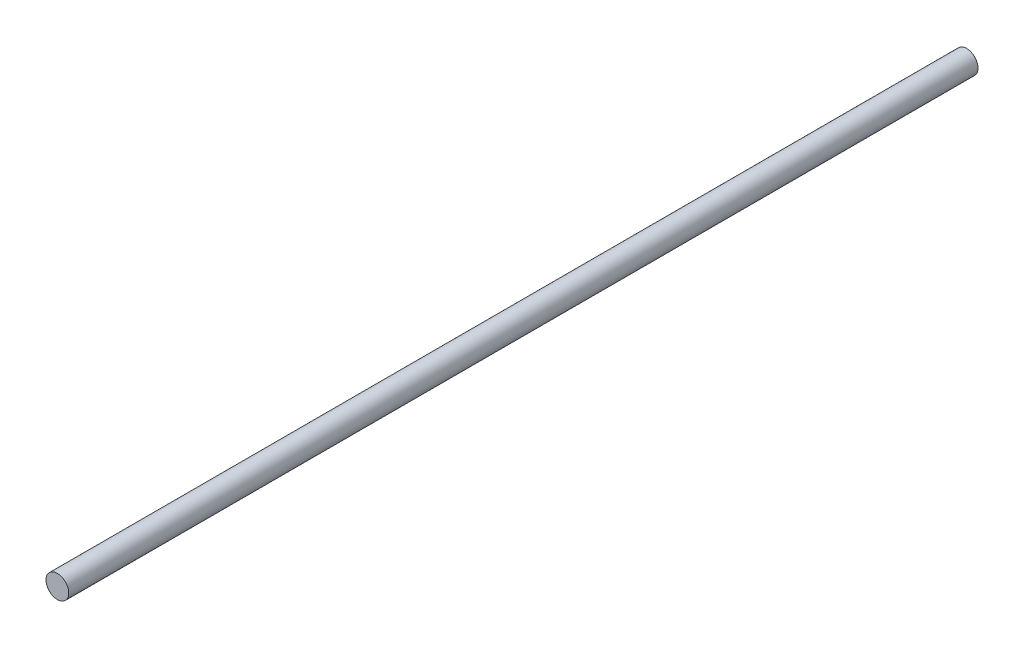
ISO-10303-21;
HEADER;
FILE_DESCRIPTION(('STEP AP214'),'2;1');
FILE_NAME('part.step','',(''),(''),'','','');
FILE_SCHEMA(('AUTOMOTIVE_DESIGN { 1 0 10303 214 1 1 1 1 }'));
ENDSEC;
DATA;
#1=APPLICATION_CONTEXT('core data for automotive mechanical design processes');
#2=APPLICATION_PROTOCOL_DEFINITION('international standard','automotive_design',2000,#1);
#3=PRODUCT_CONTEXT('',#1,'mechanical');
#4=PRODUCT('Part','Part','',(#3));
#5=PRODUCT_RELATED_PRODUCT_CATEGORY('part','',(#4));
#6=PRODUCT_DEFINITION_FORMATION('','',#4);
#7=PRODUCT_DEFINITION_CONTEXT('part definition',#1,'design');
#8=PRODUCT_DEFINITION('design','',#6,#7);
#9=PRODUCT_DEFINITION_SHAPE('','',#8);
#10=(LENGTH_UNIT() NAMED_UNIT(*) SI_UNIT(.MILLI.,.METRE.));
#11=(NAMED_UNIT(*) PLANE_ANGLE_UNIT() SI_UNIT($,.RADIAN.));
#12=(NAMED_UNIT(*) SI_UNIT($,.STERADIAN.) SOLID_ANGLE_UNIT());
#13=UNCERTAINTY_MEASURE_WITH_UNIT(LENGTH_MEASURE(1.E-05),#10,'distance_accuracy_value','');
#14=(GEOMETRIC_REPRESENTATION_CONTEXT(3) GLOBAL_UNCERTAINTY_ASSIGNED_CONTEXT((#13)) GLOBAL_UNIT_ASSIGNED_CONTEXT((#10,
#11,#12)) REPRESENTATION_CONTEXT('',''));
#15=CARTESIAN_POINT('',(0.,0.,0.));
#16=DIRECTION('',(0.,0.,1.));
#17=DIRECTION('',(1.,0.,0.));
#18=AXIS2_PLACEMENT_3D('',#15,#16,#17);
#19=CARTESIAN_POINT('',(0.,0.,304.8));
#20=DIRECTION('',(0.,0.,-1.));
#21=DIRECTION('',(-1.,0.,0.));
#22=AXIS2_PLACEMENT_3D('',#19,#20,#21);
#23=CYLINDRICAL_SURFACE('',#22,3.81);
#24=CARTESIAN_POINT('',(0.,0.,304.8));
#25=DIRECTION('',(0.,0.,1.));
#26=DIRECTION('',(1.,0.,0.));
#27=AXIS2_PLACEMENT_3D('',#24,#25,#26);
#28=CIRCLE('',#27,3.81);
#29=CARTESIAN_POINT('',(-3.81,0.,304.8));
#30=VERTEX_POINT('',#29);
#31=EDGE_CURVE('E10',#30,#30,#28,.T.);
#32=CARTESIAN_POINT('',(0.,0.,0.));
#33=DIRECTION('',(0.,0.,1.));
#34=DIRECTION('',(1.,0.,0.));
#35=AXIS2_PLACEMENT_3D('',#32,#33,#34);
#36=CIRCLE('',#35,3.81);
#37=CARTESIAN_POINT('',(-3.81,0.,0.));
#38=VERTEX_POINT('',#37);
#39=EDGE_CURVE('E46',#38,#38,#36,.T.);
#40=CARTESIAN_POINT('',(-3.81,0.,304.8));
#41=CARTESIAN_POINT('',(-3.81,0.,301.625));
#42=CARTESIAN_POINT('',(-3.81,0.,298.45));
#43=CARTESIAN_POINT('',(-3.81,0.,292.1));
#44=CARTESIAN_POINT('',(-3.81,0.,288.925));
#45=CARTESIAN_POINT('',(-3.81,0.,282.575));
#46=CARTESIAN_POINT('',(-3.81,0.,279.4));
#47=CARTESIAN_POINT('',(-3.81,0.,273.05));
#48=CARTESIAN_POINT('',(-3.81,0.,269.875));
#49=CARTESIAN_POINT('',(-3.81,0.,263.525));
#50=CARTESIAN_POINT('',(-3.81,0.,260.35));
#51=CARTESIAN_POINT('',(-3.81,0.,254.));
#52=CARTESIAN_POINT('',(-3.81,0.,250.825));
#53=CARTESIAN_POINT('',(-3.81,0.,244.475));
#54=CARTESIAN_POINT('',(-3.81,0.,241.3));
#55=CARTESIAN_POINT('',(-3.81,0.,234.95));
#56=CARTESIAN_POINT('',(-3.81,0.,231.775));
#57=CARTESIAN_POINT('',(-3.81,0.,225.425));
#58=CARTESIAN_POINT('',(-3.81,0.,222.25));
#59=CARTESIAN_POINT('',(-3.81,0.,215.9));
#60=CARTESIAN_POINT('',(-3.81,0.,212.725));
#61=CARTESIAN_POINT('',(-3.81,0.,206.375));
#62=CARTESIAN_POINT('',(-3.81,0.,203.2));
#63=CARTESIAN_POINT('',(-3.81,0.,196.85));
#64=CARTESIAN_POINT('',(-3.81,0.,193.675));
#65=CARTESIAN_POINT('',(-3.81,0.,187.325));
#66=CARTESIAN_POINT('',(-3.81,0.,184.15));
#67=CARTESIAN_POINT('',(-3.81,0.,177.8));
#68=CARTESIAN_POINT('',(-3.81,0.,174.625));
#69=CARTESIAN_POINT('',(-3.81,0.,168.275));
#70=CARTESIAN_POINT('',(-3.81,0.,165.1));
#71=CARTESIAN_POINT('',(-3.81,0.,158.75));
#72=CARTESIAN_POINT('',(-3.81,0.,155.575));
#73=CARTESIAN_POINT('',(-3.81,0.,149.225));
#74=CARTESIAN_POINT('',(-3.81,0.,146.05));
#75=CARTESIAN_POINT('',(-3.81,0.,139.7));
#76=CARTESIAN_POINT('',(-3.81,0.,136.525));
#77=CARTESIAN_POINT('',(-3.81,0.,130.175));
#78=CARTESIAN_POINT('',(-3.81,0.,127.));
#79=CARTESIAN_POINT('',(-3.81,0.,120.65));
#80=CARTESIAN_POINT('',(-3.81,0.,117.475));
#81=CARTESIAN_POINT('',(-3.81,0.,111.125));
#82=CARTESIAN_POINT('',(-3.81,0.,107.95));
#83=CARTESIAN_POINT('',(-3.81,0.,101.6));
#84=CARTESIAN_POINT('',(-3.81,0.,98.425));
#85=CARTESIAN_POINT('',(-3.81,0.,92.075));
#86=CARTESIAN_POINT('',(-3.81,0.,88.9));
#87=CARTESIAN_POINT('',(-3.81,0.,82.55));
#88=CARTESIAN_POINT('',(-3.81,0.,79.375));
#89=CARTESIAN_POINT('',(-3.81,0.,73.025));
#90=CARTESIAN_POINT('',(-3.81,0.,69.85));
#91=CARTESIAN_POINT('',(-3.81,0.,63.5));
#92=CARTESIAN_POINT('',(-3.81,0.,60.325));
#93=CARTESIAN_POINT('',(-3.81,0.,53.975));
#94=CARTESIAN_POINT('',(-3.81,0.,50.8));
#95=CARTESIAN_POINT('',(-3.81,0.,44.45));
#96=CARTESIAN_POINT('',(-3.81,0.,41.275));
#97=CARTESIAN_POINT('',(-3.81,0.,34.925));
#98=CARTESIAN_POINT('',(-3.81,0.,31.75));
#99=CARTESIAN_POINT('',(-3.81,0.,25.4));
#100=CARTESIAN_POINT('',(-3.81,0.,22.225));
#101=CARTESIAN_POINT('',(-3.81,0.,15.875));
#102=CARTESIAN_POINT('',(-3.81,0.,12.7));
#103=CARTESIAN_POINT('',(-3.81,0.,6.35));
#104=CARTESIAN_POINT('',(-3.81,0.,3.175));
#105=CARTESIAN_POINT('',(-3.81,0.,0.));
#106=B_SPLINE_CURVE_WITH_KNOTS('',3,(#40,#41,#42,#43,#44,#45,#46,#47,#48,#49,#50,#51,#52,#53,
#54,#55,#56,#57,#58,#59,#60,#61,#62,#63,#64,#65,#66,#67,#68,#69,#70,#71,#72,#73,#74,#75,#76,#77,
#78,#79,#80,#81,#82,#83,#84,#85,#86,#87,#88,#89,#90,#91,#92,#93,#94,#95,#96,#97,#98,#99,#100,
#101,#102,#103,#104,#105),.UNSPECIFIED.,.F.,.F.,(4,2,2,2,2,2,2,2,2,2,2,2,2,2,2,2,2,2,2,2,2,2,2,
2,2,2,2,2,2,2,2,2,4),(0.,9.52500000000001,19.05,28.575,38.1,47.625,57.15,66.675,76.2,
85.7250000000001,95.2500000000001,104.775,114.3,123.825,133.35,142.875,152.4,161.925,171.45,
180.975,190.5,200.025,209.55,219.075,228.6,238.125,247.65,257.175,266.7,276.225,285.75,295.275,
304.8),.UNSPECIFIED.);
#107=EDGE_CURVE('BSEAM43',#30,#38,#106,.T.);
#108=ORIENTED_EDGE('',*,*,#31,.F.);
#109=ORIENTED_EDGE('',*,*,#39,.T.);
#110=ORIENTED_EDGE('',*,*,#107,.T.);
#111=ORIENTED_EDGE('',*,*,#107,.F.);
#112=EDGE_LOOP('',(#108,#110,#109,#111));
#113=FACE_BOUND('',#112,.T.);
#114=ADVANCED_FACE('F43',(#113),#23,.T.);
#115=CARTESIAN_POINT('',(0.,0.,304.8));
#116=DIRECTION('',(0.,0.,1.));
#117=DIRECTION('',(1.,0.,0.));
#118=AXIS2_PLACEMENT_3D('',#115,#116,#117);
#119=PLANE('',#118);
#120=ORIENTED_EDGE('',*,*,#31,.T.);
#121=EDGE_LOOP('',(#120));
#122=FACE_BOUND('',#121,.T.);
#123=ADVANCED_FACE('F60',(#122),#119,.T.);
#124=CARTESIAN_POINT('',(0.,0.,0.));
#125=DIRECTION('',(0.,0.,1.));
#126=DIRECTION('',(1.,0.,0.));
#127=AXIS2_PLACEMENT_3D('',#124,#125,#126);
#128=PLANE('',#127);
#129=ORIENTED_EDGE('',*,*,#39,.F.);
#130=EDGE_LOOP('',(#129));
#131=FACE_BOUND('',#130,.T.);
#132=ADVANCED_FACE('F58',(#131),#128,.F.);
#133=CLOSED_SHELL('',(#114,#123,#132));
#134=MANIFOLD_SOLID_BREP('B2',#133);
#135=ADVANCED_BREP_SHAPE_REPRESENTATION('',(#18,#134),#14);
#136=SHAPE_DEFINITION_REPRESENTATION(#9,#135);
ENDSEC;
END-ISO-10303-21;
